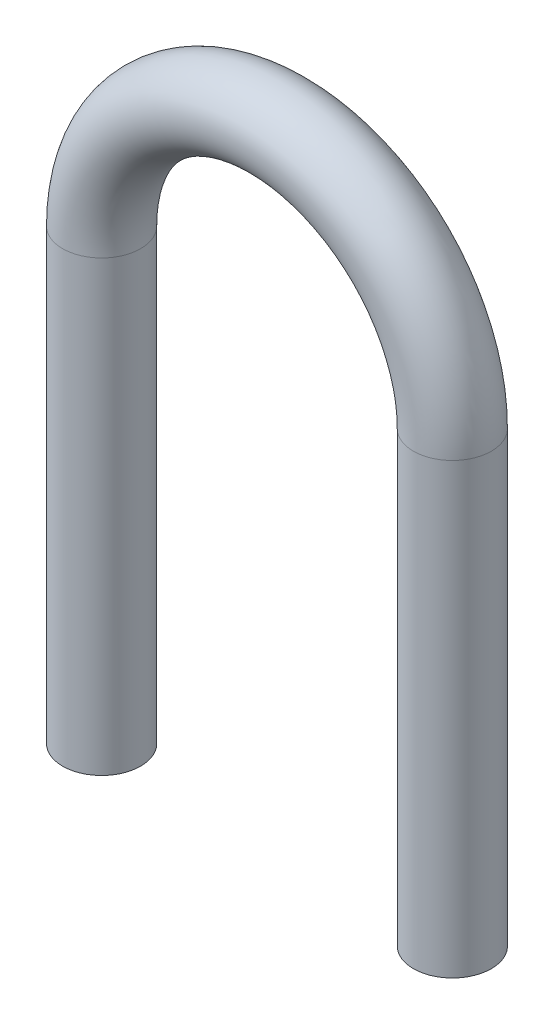
ISO-10303-21;
HEADER;
FILE_DESCRIPTION(('STEP AP214'),'2;1');
FILE_NAME('part.step','',(''),(''),'','','');
FILE_SCHEMA(('AUTOMOTIVE_DESIGN { 1 0 10303 214 1 1 1 1 }'));
ENDSEC;
DATA;
#1=APPLICATION_CONTEXT('core data for automotive mechanical design processes');
#2=APPLICATION_PROTOCOL_DEFINITION('international standard','automotive_design',2000,#1);
#3=PRODUCT_CONTEXT('',#1,'mechanical');
#4=PRODUCT('Part','Part','',(#3));
#5=PRODUCT_RELATED_PRODUCT_CATEGORY('part','',(#4));
#6=PRODUCT_DEFINITION_FORMATION('','',#4);
#7=PRODUCT_DEFINITION_CONTEXT('part definition',#1,'design');
#8=PRODUCT_DEFINITION('design','',#6,#7);
#9=PRODUCT_DEFINITION_SHAPE('','',#8);
#10=(LENGTH_UNIT() NAMED_UNIT(*) SI_UNIT(.MILLI.,.METRE.));
#11=(NAMED_UNIT(*) PLANE_ANGLE_UNIT() SI_UNIT($,.RADIAN.));
#12=(NAMED_UNIT(*) SI_UNIT($,.STERADIAN.) SOLID_ANGLE_UNIT());
#13=UNCERTAINTY_MEASURE_WITH_UNIT(LENGTH_MEASURE(1.E-05),#10,'distance_accuracy_value','');
#14=(GEOMETRIC_REPRESENTATION_CONTEXT(3) GLOBAL_UNCERTAINTY_ASSIGNED_CONTEXT((#13)) GLOBAL_UNIT_ASSIGNED_CONTEXT((#10,
#11,#12)) REPRESENTATION_CONTEXT('',''));
#15=CARTESIAN_POINT('',(0.,0.,0.));
#16=DIRECTION('',(0.,0.,1.));
#17=DIRECTION('',(1.,0.,0.));
#18=AXIS2_PLACEMENT_3D('',#15,#16,#17);
#19=CARTESIAN_POINT('',(-13.5,-48.,0.));
#20=DIRECTION('',(0.,1.,0.));
#21=DIRECTION('',(0.,0.,1.));
#22=AXIS2_PLACEMENT_3D('',#19,#20,#21);
#23=PLANE('',#22);
#24=CARTESIAN_POINT('',(-13.5,-48.,0.));
#25=DIRECTION('',(0.,1.,0.));
#26=DIRECTION('',(0.,0.,1.));
#27=AXIS2_PLACEMENT_3D('',#24,#25,#26);
#28=CIRCLE('',#27,3.);
#29=CARTESIAN_POINT('',(-13.5,-48.,3.));
#30=VERTEX_POINT('',#29);
#31=EDGE_CURVE('E46',#30,#30,#28,.T.);
#32=ORIENTED_EDGE('',*,*,#31,.F.);
#33=EDGE_LOOP('',(#32));
#34=FACE_BOUND('',#33,.T.);
#35=ADVANCED_FACE('F32',(#34),#23,.F.);
#36=CARTESIAN_POINT('',(13.5,-48.,0.));
#37=DIRECTION('',(0.,-1.,0.));
#38=DIRECTION('',(0.,0.,1.));
#39=AXIS2_PLACEMENT_3D('',#36,#37,#38);
#40=PLANE('',#39);
#41=CARTESIAN_POINT('',(13.5,-48.,0.));
#42=DIRECTION('',(0.,-1.,0.));
#43=DIRECTION('',(0.,0.,1.));
#44=AXIS2_PLACEMENT_3D('',#41,#42,#43);
#45=CIRCLE('',#44,3.);
#46=CARTESIAN_POINT('',(13.5,-48.,3.));
#47=VERTEX_POINT('',#46);
#48=EDGE_CURVE('E10',#47,#47,#45,.T.);
#49=ORIENTED_EDGE('',*,*,#48,.T.);
#50=EDGE_LOOP('',(#49));
#51=FACE_BOUND('',#50,.T.);
#52=ADVANCED_FACE('F55',(#51),#40,.T.);
#53=CARTESIAN_POINT('',(-13.5,-48.,0.));
#54=DIRECTION('',(0.,1.,0.));
#55=DIRECTION('',(-1.,0.,0.));
#56=AXIS2_PLACEMENT_3D('',#53,#54,#55);
#57=CYLINDRICAL_SURFACE('',#56,3.);
#58=CARTESIAN_POINT('',(-13.5,-13.5,0.));
#59=DIRECTION('',(0.,1.,0.));
#60=DIRECTION('',(0.,0.,1.));
#61=AXIS2_PLACEMENT_3D('',#58,#59,#60);
#62=CIRCLE('',#61,3.);
#63=CARTESIAN_POINT('',(-16.5,-13.5,0.));
#64=VERTEX_POINT('',#63);
#65=EDGE_CURVE('E42',#64,#64,#62,.T.);
#66=ORIENTED_EDGE('',*,*,#65,.F.);
#67=EDGE_LOOP('',(#66));
#68=FACE_BOUND('',#67,.T.);
#69=ORIENTED_EDGE('',*,*,#31,.T.);
#70=EDGE_LOOP('',(#69));
#71=FACE_BOUND('',#70,.T.);
#72=ADVANCED_FACE('F52',(#68,#71),#57,.T.);
#73=CARTESIAN_POINT('',(0.,-13.5,0.));
#74=DIRECTION('',(0.,0.,-1.));
#75=DIRECTION('',(-1.,0.,0.));
#76=AXIS2_PLACEMENT_3D('',#73,#74,#75);
#77=TOROIDAL_SURFACE('',#76,13.5,3.);
#78=CARTESIAN_POINT('',(13.5,-13.5,0.));
#79=DIRECTION('',(0.,-1.,0.));
#80=DIRECTION('',(0.,0.,1.));
#81=AXIS2_PLACEMENT_3D('',#78,#79,#80);
#82=CIRCLE('',#81,3.);
#83=CARTESIAN_POINT('',(16.5,-13.5,0.));
#84=VERTEX_POINT('',#83);
#85=EDGE_CURVE('E38',#84,#84,#82,.T.);
#86=CARTESIAN_POINT('',(0.,-13.5,0.));
#87=DIRECTION('',(0.,0.,-1.));
#88=DIRECTION('',(-1.,0.,0.));
#89=AXIS2_PLACEMENT_3D('',#86,#87,#88);
#90=CIRCLE('',#89,16.5);
#91=EDGE_CURVE('',#64,#84,#90,.T.);
#92=ORIENTED_EDGE('',*,*,#65,.T.);
#93=ORIENTED_EDGE('',*,*,#85,.F.);
#94=ORIENTED_EDGE('',*,*,#91,.T.);
#95=ORIENTED_EDGE('',*,*,#91,.F.);
#96=EDGE_LOOP('',(#92,#94,#93,#95));
#97=FACE_BOUND('',#96,.T.);
#98=ADVANCED_FACE('F61',(#97),#77,.T.);
#99=CARTESIAN_POINT('',(13.5,-13.5,0.));
#100=DIRECTION('',(0.,-1.,0.));
#101=DIRECTION('',(1.,0.,0.));
#102=AXIS2_PLACEMENT_3D('',#99,#100,#101);
#103=CYLINDRICAL_SURFACE('',#102,3.);
#104=ORIENTED_EDGE('',*,*,#48,.F.);
#105=EDGE_LOOP('',(#104));
#106=FACE_BOUND('',#105,.T.);
#107=ORIENTED_EDGE('',*,*,#85,.T.);
#108=EDGE_LOOP('',(#107));
#109=FACE_BOUND('',#108,.T.);
#110=ADVANCED_FACE('F59',(#106,#109),#103,.T.);
#111=CLOSED_SHELL('',(#35,#52,#72,#98,#110));
#112=MANIFOLD_SOLID_BREP('B2',#111);
#113=ADVANCED_BREP_SHAPE_REPRESENTATION('',(#18,#112),#14);
#114=SHAPE_DEFINITION_REPRESENTATION(#9,#113);
ENDSEC;
END-ISO-10303-21;
